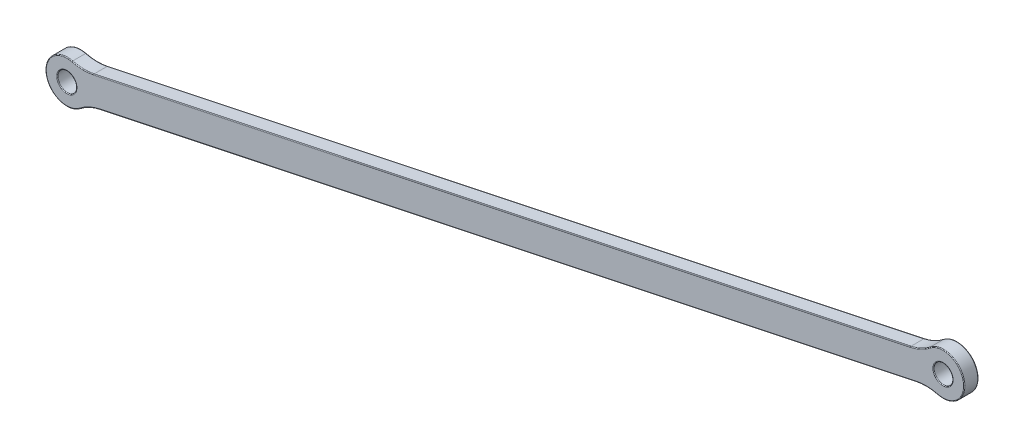
ISO-10303-21;
HEADER;
FILE_DESCRIPTION(('STEP AP214'),'2;1');
FILE_NAME('part.step','',(''),(''),'','','');
FILE_SCHEMA(('AUTOMOTIVE_DESIGN { 1 0 10303 214 1 1 1 1 }'));
ENDSEC;
DATA;
#1=APPLICATION_CONTEXT('core data for automotive mechanical design processes');
#2=APPLICATION_PROTOCOL_DEFINITION('international standard','automotive_design',2000,#1);
#3=PRODUCT_CONTEXT('',#1,'mechanical');
#4=PRODUCT('Part','Part','',(#3));
#5=PRODUCT_RELATED_PRODUCT_CATEGORY('part','',(#4));
#6=PRODUCT_DEFINITION_FORMATION('','',#4);
#7=PRODUCT_DEFINITION_CONTEXT('part definition',#1,'design');
#8=PRODUCT_DEFINITION('design','',#6,#7);
#9=PRODUCT_DEFINITION_SHAPE('','',#8);
#10=(LENGTH_UNIT() NAMED_UNIT(*) SI_UNIT(.MILLI.,.METRE.));
#11=(NAMED_UNIT(*) PLANE_ANGLE_UNIT() SI_UNIT($,.RADIAN.));
#12=(NAMED_UNIT(*) SI_UNIT($,.STERADIAN.) SOLID_ANGLE_UNIT());
#13=UNCERTAINTY_MEASURE_WITH_UNIT(LENGTH_MEASURE(1.E-05),#10,'distance_accuracy_value','');
#14=(GEOMETRIC_REPRESENTATION_CONTEXT(3) GLOBAL_UNCERTAINTY_ASSIGNED_CONTEXT((#13)) GLOBAL_UNIT_ASSIGNED_CONTEXT((#10,
#11,#12)) REPRESENTATION_CONTEXT('',''));
#15=CARTESIAN_POINT('',(0.,0.,0.));
#16=DIRECTION('',(0.,0.,1.));
#17=DIRECTION('',(1.,0.,0.));
#18=AXIS2_PLACEMENT_3D('',#15,#16,#17);
#19=CARTESIAN_POINT('',(-48.2386771546592,228.345201245127,-3.));
#20=DIRECTION('',(0.206691529175114,-0.978406158896832,0.));
#21=DIRECTION('',(0.978406158896832,0.206691529175114,0.));
#22=AXIS2_PLACEMENT_3D('',#19,#20,#21);
#23=PLANE('',#22);
#24=DIRECTION('',(0.,0.,-1.));
#25=VECTOR('',#24,1.);
#26=CARTESIAN_POINT('',(-203.551219813431,195.534914177421,-3.));
#27=LINE('',#26,#25);
#28=CARTESIAN_POINT('',(-203.551219813431,195.534914177421,-0.15));
#29=VERTEX_POINT('',#28);
#30=CARTESIAN_POINT('',(-203.551219813431,195.534914177421,-2.85));
#31=VERTEX_POINT('',#30);
#32=EDGE_CURVE('E302',#29,#31,#27,.T.);
#33=ORIENTED_EDGE('',*,*,#32,.T.);
#34=DIRECTION('',(0.978406158896832,0.206691529175114,0.));
#35=VECTOR('',#34,1.);
#36=CARTESIAN_POINT('',(-30.6132667540202,232.068627344728,-2.85));
#37=LINE('',#36,#35);
#38=CARTESIAN_POINT('',(-30.6132667540202,232.068627344728,-2.85));
#39=VERTEX_POINT('',#38);
#40=EDGE_CURVE('E209',#31,#39,#37,.T.);
#41=ORIENTED_EDGE('',*,*,#40,.T.);
#42=DIRECTION('',(0.,0.,-1.));
#43=VECTOR('',#42,1.);
#44=CARTESIAN_POINT('',(-30.6132667540202,232.068627344728,0.));
#45=LINE('',#44,#43);
#46=CARTESIAN_POINT('',(-30.6132667540202,232.068627344728,-0.15));
#47=VERTEX_POINT('',#46);
#48=EDGE_CURVE('E296',#39,#47,#45,.F.);
#49=ORIENTED_EDGE('',*,*,#48,.T.);
#50=DIRECTION('',(0.978406158896832,0.206691529175114,0.));
#51=VECTOR('',#50,1.);
#52=CARTESIAN_POINT('',(-48.2386771546592,228.345201245127,-0.15));
#53=LINE('',#52,#51);
#54=EDGE_CURVE('E207',#47,#29,#53,.F.);
#55=ORIENTED_EDGE('',*,*,#54,.T.);
#56=EDGE_LOOP('',(#33,#41,#49,#55));
#57=FACE_BOUND('',#56,.T.);
#58=ADVANCED_FACE('F34',(#57),#23,.T.);
#59=CARTESIAN_POINT('',(-210.455221734671,197.142632271964,-3.));
#60=DIRECTION('',(0.,0.,1.));
#61=DIRECTION('',(1.,0.,0.));
#62=AXIS2_PLACEMENT_3D('',#59,#60,#61);
#63=CYLINDRICAL_SURFACE('',#62,4.5);
#64=DIRECTION('',(0.,0.,1.));
#65=VECTOR('',#64,1.);
#66=CARTESIAN_POINT('',(-209.338930800535,201.50197792818,-3.));
#67=LINE('',#66,#65);
#68=CARTESIAN_POINT('',(-209.338930800535,201.50197792818,-0.15));
#69=VERTEX_POINT('',#68);
#70=CARTESIAN_POINT('',(-209.338930800535,201.50197792818,-2.85));
#71=VERTEX_POINT('',#70);
#72=EDGE_CURVE('E301',#69,#71,#67,.F.);
#73=ORIENTED_EDGE('',*,*,#72,.T.);
#74=CARTESIAN_POINT('',(-210.455221734671,197.142632271964,-2.85));
#75=DIRECTION('',(0.,0.,1.));
#76=DIRECTION('',(1.,0.,0.));
#77=AXIS2_PLACEMENT_3D('',#74,#75,#76);
#78=CIRCLE('',#77,4.5);
#79=CARTESIAN_POINT('',(-207.671143978915,193.607252370185,-2.85));
#80=VERTEX_POINT('',#79);
#81=EDGE_CURVE('E201',#71,#80,#78,.T.);
#82=ORIENTED_EDGE('',*,*,#81,.T.);
#83=DIRECTION('',(0.,0.,1.));
#84=VECTOR('',#83,1.);
#85=CARTESIAN_POINT('',(-207.671143978915,193.607252370185,-3.));
#86=LINE('',#85,#84);
#87=CARTESIAN_POINT('',(-207.671143978915,193.607252370185,-0.15));
#88=VERTEX_POINT('',#87);
#89=EDGE_CURVE('E305',#80,#88,#86,.T.);
#90=ORIENTED_EDGE('',*,*,#89,.T.);
#91=CARTESIAN_POINT('',(-210.455221734671,197.142632271964,-0.15));
#92=DIRECTION('',(0.,0.,1.));
#93=DIRECTION('',(1.,0.,0.));
#94=AXIS2_PLACEMENT_3D('',#91,#92,#93);
#95=CIRCLE('',#94,4.5);
#96=EDGE_CURVE('E199',#88,#69,#95,.F.);
#97=ORIENTED_EDGE('',*,*,#96,.T.);
#98=EDGE_LOOP('',(#73,#82,#90,#97));
#99=FACE_BOUND('',#98,.T.);
#100=ADVANCED_FACE('F367',(#99),#63,.T.);
#101=CARTESIAN_POINT('',(-49.4788263297099,234.215638198508,-3.));
#102=DIRECTION('',(0.206691529175114,-0.978406158896832,0.));
#103=DIRECTION('',(0.978406158896832,0.206691529175114,0.));
#104=AXIS2_PLACEMENT_3D('',#101,#102,#103);
#105=PLANE('',#104);
#106=DIRECTION('',(0.,0.,1.));
#107=VECTOR('',#106,1.);
#108=CARTESIAN_POINT('',(-31.8534159290709,237.939064298109,-3.));
#109=LINE('',#108,#107);
#110=CARTESIAN_POINT('',(-31.8534159290709,237.939064298109,-0.15));
#111=VERTEX_POINT('',#110);
#112=CARTESIAN_POINT('',(-31.8534159290709,237.939064298109,-2.85));
#113=VERTEX_POINT('',#112);
#114=EDGE_CURVE('E307',#111,#113,#109,.F.);
#115=ORIENTED_EDGE('',*,*,#114,.T.);
#116=DIRECTION('',(0.978406158896832,0.206691529175114,0.));
#117=VECTOR('',#116,1.);
#118=CARTESIAN_POINT('',(-49.4788263297099,234.215638198508,-2.85));
#119=LINE('',#118,#117);
#120=CARTESIAN_POINT('',(-204.791368988482,201.405351130802,-2.85));
#121=VERTEX_POINT('',#120);
#122=EDGE_CURVE('E192',#113,#121,#119,.F.);
#123=ORIENTED_EDGE('',*,*,#122,.T.);
#124=DIRECTION('',(0.,0.,1.));
#125=VECTOR('',#124,1.);
#126=CARTESIAN_POINT('',(-204.791368988482,201.405351130802,-3.));
#127=LINE('',#126,#125);
#128=CARTESIAN_POINT('',(-204.791368988482,201.405351130802,-0.15));
#129=VERTEX_POINT('',#128);
#130=EDGE_CURVE('E340',#121,#129,#127,.T.);
#131=ORIENTED_EDGE('',*,*,#130,.T.);
#132=DIRECTION('',(0.978406158896832,0.206691529175114,0.));
#133=VECTOR('',#132,1.);
#134=CARTESIAN_POINT('',(-31.8534159290709,237.939064298109,-0.15));
#135=LINE('',#134,#133);
#136=EDGE_CURVE('E190',#129,#111,#135,.T.);
#137=ORIENTED_EDGE('',*,*,#136,.T.);
#138=EDGE_LOOP('',(#115,#123,#131,#137));
#139=FACE_BOUND('',#138,.T.);
#140=ADVANCED_FACE('F348',(#139),#105,.F.);
#141=CARTESIAN_POINT('',(-210.455221734671,197.142632271964,-3.));
#142=DIRECTION('',(0.,0.,1.));
#143=DIRECTION('',(1.,0.,0.));
#144=AXIS2_PLACEMENT_3D('',#141,#142,#143);
#145=CYLINDRICAL_SURFACE('',#144,2.);
#146=CARTESIAN_POINT('',(-210.455221734671,197.142632271964,-2.85));
#147=DIRECTION('',(0.,0.,1.));
#148=DIRECTION('',(1.,0.,0.));
#149=AXIS2_PLACEMENT_3D('',#146,#147,#148);
#150=CIRCLE('',#149,2.);
#151=CARTESIAN_POINT('',(-208.455221734671,197.142632271964,-2.85));
#152=VERTEX_POINT('',#151);
#153=EDGE_CURVE('E214',#152,#152,#150,.F.);
#154=ORIENTED_EDGE('',*,*,#153,.T.);
#155=EDGE_LOOP('',(#154));
#156=FACE_BOUND('',#155,.T.);
#157=CARTESIAN_POINT('',(-210.455221734671,197.142632271964,-0.15));
#158=DIRECTION('',(0.,0.,1.));
#159=DIRECTION('',(1.,0.,0.));
#160=AXIS2_PLACEMENT_3D('',#157,#158,#159);
#161=CIRCLE('',#160,2.);
#162=CARTESIAN_POINT('',(-208.455221734671,197.142632271964,-0.15));
#163=VERTEX_POINT('',#162);
#164=EDGE_CURVE('E211',#163,#163,#161,.T.);
#165=ORIENTED_EDGE('',*,*,#164,.T.);
#166=EDGE_LOOP('',(#165));
#167=FACE_BOUND('',#166,.T.);
#168=ADVANCED_FACE('F403',(#156,#167),#145,.F.);
#169=CARTESIAN_POINT('',(-24.9494140078315,236.331346203566,-3.));
#170=DIRECTION('',(0.,0.,1.));
#171=DIRECTION('',(1.,0.,0.));
#172=AXIS2_PLACEMENT_3D('',#169,#170,#171);
#173=CYLINDRICAL_SURFACE('',#172,2.);
#174=CARTESIAN_POINT('',(-24.9494140078315,236.331346203566,-2.85));
#175=DIRECTION('',(0.,0.,1.));
#176=DIRECTION('',(1.,0.,0.));
#177=AXIS2_PLACEMENT_3D('',#174,#175,#176);
#178=CIRCLE('',#177,2.);
#179=CARTESIAN_POINT('',(-22.9494140078315,236.331346203566,-2.85));
#180=VERTEX_POINT('',#179);
#181=EDGE_CURVE('E220',#180,#180,#178,.F.);
#182=ORIENTED_EDGE('',*,*,#181,.T.);
#183=EDGE_LOOP('',(#182));
#184=FACE_BOUND('',#183,.T.);
#185=CARTESIAN_POINT('',(-24.9494140078315,236.331346203566,-0.15));
#186=DIRECTION('',(0.,0.,1.));
#187=DIRECTION('',(1.,0.,0.));
#188=AXIS2_PLACEMENT_3D('',#185,#186,#187);
#189=CIRCLE('',#188,2.);
#190=CARTESIAN_POINT('',(-22.9494140078315,236.331346203566,-0.15));
#191=VERTEX_POINT('',#190);
#192=EDGE_CURVE('E217',#191,#191,#189,.T.);
#193=ORIENTED_EDGE('',*,*,#192,.T.);
#194=EDGE_LOOP('',(#193));
#195=FACE_BOUND('',#194,.T.);
#196=ADVANCED_FACE('F405',(#184,#195),#173,.F.);
#197=CARTESIAN_POINT('',(-24.9494140078315,236.331346203566,-3.));
#198=DIRECTION('',(0.,0.,1.));
#199=DIRECTION('',(1.,0.,0.));
#200=AXIS2_PLACEMENT_3D('',#197,#198,#199);
#201=CYLINDRICAL_SURFACE('',#200,4.5);
#202=DIRECTION('',(0.,0.,1.));
#203=VECTOR('',#202,1.);
#204=CARTESIAN_POINT('',(-26.0657049419673,231.97200054735,-3.));
#205=LINE('',#204,#203);
#206=CARTESIAN_POINT('',(-26.0657049419673,231.97200054735,-0.15));
#207=VERTEX_POINT('',#206);
#208=CARTESIAN_POINT('',(-26.0657049419673,231.97200054735,-2.85));
#209=VERTEX_POINT('',#208);
#210=EDGE_CURVE('E258',#207,#209,#205,.F.);
#211=ORIENTED_EDGE('',*,*,#210,.T.);
#212=CARTESIAN_POINT('',(-24.9494140078315,236.331346203566,-2.85));
#213=DIRECTION('',(0.,0.,1.));
#214=DIRECTION('',(1.,0.,0.));
#215=AXIS2_PLACEMENT_3D('',#212,#213,#214);
#216=CIRCLE('',#215,4.5);
#217=CARTESIAN_POINT('',(-27.7334917635872,239.866726105345,-2.85));
#218=VERTEX_POINT('',#217);
#219=EDGE_CURVE('E184',#209,#218,#216,.T.);
#220=ORIENTED_EDGE('',*,*,#219,.T.);
#221=DIRECTION('',(0.,0.,1.));
#222=VECTOR('',#221,1.);
#223=CARTESIAN_POINT('',(-27.7334917635872,239.866726105345,-3.));
#224=LINE('',#223,#222);
#225=CARTESIAN_POINT('',(-27.7334917635872,239.866726105345,-0.15));
#226=VERTEX_POINT('',#225);
#227=EDGE_CURVE('E338',#218,#226,#224,.T.);
#228=ORIENTED_EDGE('',*,*,#227,.T.);
#229=CARTESIAN_POINT('',(-24.9494140078315,236.331346203566,-0.15));
#230=DIRECTION('',(0.,0.,1.));
#231=DIRECTION('',(1.,0.,0.));
#232=AXIS2_PLACEMENT_3D('',#229,#230,#231);
#233=CIRCLE('',#232,4.5);
#234=EDGE_CURVE('E182',#226,#207,#233,.F.);
#235=ORIENTED_EDGE('',*,*,#234,.T.);
#236=EDGE_LOOP('',(#211,#220,#228,#235));
#237=FACE_BOUND('',#236,.T.);
#238=ADVANCED_FACE('F337',(#237),#201,.T.);
#239=CARTESIAN_POINT('',(0.,0.,-3.));
#240=DIRECTION('',(0.,0.,1.));
#241=DIRECTION('',(1.,0.,0.));
#242=AXIS2_PLACEMENT_3D('',#239,#240,#241);
#243=PLANE('',#242);
#244=CARTESIAN_POINT('',(-24.9494140078315,236.331346203566,-3.));
#245=DIRECTION('',(0.,0.,1.));
#246=DIRECTION('',(1.,0.,0.));
#247=AXIS2_PLACEMENT_3D('',#244,#245,#246);
#248=CIRCLE('',#247,4.35);
#249=CARTESIAN_POINT('',(-27.6406891717287,239.748880108619,-3.));
#250=VERTEX_POINT('',#249);
#251=CARTESIAN_POINT('',(-26.0284952441628,232.117312069224,-3.));
#252=VERTEX_POINT('',#251);
#253=EDGE_CURVE('E172',#250,#252,#248,.F.);
#254=ORIENTED_EDGE('',*,*,#253,.T.);
#255=CARTESIAN_POINT('',(-28.5463514622691,222.28456575576,-3.));
#256=DIRECTION('',(0.,0.,1.));
#257=DIRECTION('',(1.,0.,0.));
#258=AXIS2_PLACEMENT_3D('',#255,#256,#257);
#259=CIRCLE('',#258,10.15);
#260=CARTESIAN_POINT('',(-30.6442704833965,232.215388268563,-3.));
#261=VERTEX_POINT('',#260);
#262=EDGE_CURVE('E152',#252,#261,#259,.T.);
#263=ORIENTED_EDGE('',*,*,#262,.T.);
#264=DIRECTION('',(0.978406158896832,0.206691529175114,0.));
#265=VECTOR('',#264,1.);
#266=CARTESIAN_POINT('',(-203.582223542808,195.681675101255,-3.));
#267=LINE('',#266,#265);
#268=CARTESIAN_POINT('',(-203.582223542808,195.681675101255,-3.));
#269=VERTEX_POINT('',#268);
#270=EDGE_CURVE('E160',#261,#269,#267,.F.);
#271=ORIENTED_EDGE('',*,*,#270,.T.);
#272=CARTESIAN_POINT('',(-201.48430452168,185.750852588453,-3.));
#273=DIRECTION('',(0.,0.,1.));
#274=DIRECTION('',(1.,0.,0.));
#275=AXIS2_PLACEMENT_3D('',#272,#273,#274);
#276=CIRCLE('',#275,10.15);
#277=CARTESIAN_POINT('',(-207.763946570774,193.725098366911,-3.));
#278=VERTEX_POINT('',#277);
#279=EDGE_CURVE('E166',#269,#278,#276,.T.);
#280=ORIENTED_EDGE('',*,*,#279,.T.);
#281=CARTESIAN_POINT('',(-210.455221734671,197.142632271964,-3.));
#282=DIRECTION('',(0.,0.,1.));
#283=DIRECTION('',(1.,0.,0.));
#284=AXIS2_PLACEMENT_3D('',#281,#282,#283);
#285=CIRCLE('',#284,4.35);
#286=CARTESIAN_POINT('',(-209.37614049834,201.356666406306,-3.));
#287=VERTEX_POINT('',#286);
#288=EDGE_CURVE('E319',#278,#287,#285,.F.);
#289=ORIENTED_EDGE('',*,*,#288,.T.);
#290=CARTESIAN_POINT('',(-206.858284280233,211.18941271977,-3.));
#291=DIRECTION('',(0.,0.,1.));
#292=DIRECTION('',(1.,0.,0.));
#293=AXIS2_PLACEMENT_3D('',#290,#291,#292);
#294=CIRCLE('',#293,10.15);
#295=CARTESIAN_POINT('',(-204.760365259106,201.258590206967,-3.));
#296=VERTEX_POINT('',#295);
#297=EDGE_CURVE('E321',#287,#296,#294,.T.);
#298=ORIENTED_EDGE('',*,*,#297,.T.);
#299=DIRECTION('',(0.978406158896832,0.206691529175114,0.));
#300=VECTOR('',#299,1.);
#301=CARTESIAN_POINT('',(-49.4478226003336,234.068877274674,-3.));
#302=LINE('',#301,#300);
#303=CARTESIAN_POINT('',(-31.8224121996946,237.792303374275,-3.));
#304=VERTEX_POINT('',#303);
#305=EDGE_CURVE('E323',#296,#304,#302,.T.);
#306=ORIENTED_EDGE('',*,*,#305,.T.);
#307=CARTESIAN_POINT('',(-33.920331220822,247.723125887078,-3.));
#308=DIRECTION('',(0.,0.,1.));
#309=DIRECTION('',(1.,0.,0.));
#310=AXIS2_PLACEMENT_3D('',#307,#308,#309);
#311=CIRCLE('',#310,10.15);
#312=EDGE_CURVE('E177',#304,#250,#311,.T.);
#313=ORIENTED_EDGE('',*,*,#312,.T.);
#314=EDGE_LOOP('',(#254,#263,#271,#280,#289,#298,#306,#313));
#315=FACE_BOUND('',#314,.T.);
#316=CARTESIAN_POINT('',(-210.455221734671,197.142632271964,-3.));
#317=DIRECTION('',(0.,0.,1.));
#318=DIRECTION('',(1.,0.,0.));
#319=AXIS2_PLACEMENT_3D('',#316,#317,#318);
#320=CIRCLE('',#319,2.15);
#321=CARTESIAN_POINT('',(-208.305221734671,197.142632271964,-3.));
#322=VERTEX_POINT('',#321);
#323=EDGE_CURVE('E167',#322,#322,#320,.T.);
#324=ORIENTED_EDGE('',*,*,#323,.T.);
#325=EDGE_LOOP('',(#324));
#326=FACE_BOUND('',#325,.T.);
#327=CARTESIAN_POINT('',(-24.9494140078315,236.331346203566,-3.));
#328=DIRECTION('',(0.,0.,1.));
#329=DIRECTION('',(1.,0.,0.));
#330=AXIS2_PLACEMENT_3D('',#327,#328,#329);
#331=CIRCLE('',#330,2.15);
#332=CARTESIAN_POINT('',(-22.7994140078315,236.331346203566,-3.));
#333=VERTEX_POINT('',#332);
#334=EDGE_CURVE('E313',#333,#333,#331,.T.);
#335=ORIENTED_EDGE('',*,*,#334,.T.);
#336=EDGE_LOOP('',(#335));
#337=FACE_BOUND('',#336,.T.);
#338=ADVANCED_FACE('F169',(#315,#326,#337),#243,.F.);
#339=CARTESIAN_POINT('',(0.,0.,0.));
#340=DIRECTION('',(0.,0.,1.));
#341=DIRECTION('',(1.,0.,0.));
#342=AXIS2_PLACEMENT_3D('',#339,#340,#341);
#343=PLANE('',#342);
#344=DIRECTION('',(0.978406158896832,0.206691529175114,0.));
#345=VECTOR('',#344,1.);
#346=CARTESIAN_POINT('',(-204.760365259106,201.258590206967,0.));
#347=LINE('',#346,#345);
#348=CARTESIAN_POINT('',(-31.8224121996946,237.792303374275,0.));
#349=VERTEX_POINT('',#348);
#350=CARTESIAN_POINT('',(-204.760365259106,201.258590206967,0.));
#351=VERTEX_POINT('',#350);
#352=EDGE_CURVE('E43',#349,#351,#347,.F.);
#353=ORIENTED_EDGE('',*,*,#352,.T.);
#354=CARTESIAN_POINT('',(-206.858284280233,211.18941271977,0.));
#355=DIRECTION('',(0.,0.,1.));
#356=DIRECTION('',(1.,0.,0.));
#357=AXIS2_PLACEMENT_3D('',#354,#355,#356);
#358=CIRCLE('',#357,10.15);
#359=CARTESIAN_POINT('',(-209.37614049834,201.356666406306,0.));
#360=VERTEX_POINT('',#359);
#361=EDGE_CURVE('E11',#351,#360,#358,.F.);
#362=ORIENTED_EDGE('',*,*,#361,.T.);
#363=CARTESIAN_POINT('',(-210.455221734671,197.142632271964,0.));
#364=DIRECTION('',(0.,0.,1.));
#365=DIRECTION('',(1.,0.,0.));
#366=AXIS2_PLACEMENT_3D('',#363,#364,#365);
#367=CIRCLE('',#366,4.35);
#368=CARTESIAN_POINT('',(-207.763946570774,193.725098366911,0.));
#369=VERTEX_POINT('',#368);
#370=EDGE_CURVE('E229',#360,#369,#367,.T.);
#371=ORIENTED_EDGE('',*,*,#370,.T.);
#372=CARTESIAN_POINT('',(-201.48430452168,185.750852588453,0.));
#373=DIRECTION('',(0.,0.,1.));
#374=DIRECTION('',(1.,0.,0.));
#375=AXIS2_PLACEMENT_3D('',#372,#373,#374);
#376=CIRCLE('',#375,10.15);
#377=CARTESIAN_POINT('',(-203.582223542808,195.681675101255,0.));
#378=VERTEX_POINT('',#377);
#379=EDGE_CURVE('E231',#369,#378,#376,.F.);
#380=ORIENTED_EDGE('',*,*,#379,.T.);
#381=DIRECTION('',(0.978406158896832,0.206691529175114,0.));
#382=VECTOR('',#381,1.);
#383=CARTESIAN_POINT('',(-48.2696808840355,228.491962168962,0.));
#384=LINE('',#383,#382);
#385=CARTESIAN_POINT('',(-30.6442704833965,232.215388268563,0.));
#386=VERTEX_POINT('',#385);
#387=EDGE_CURVE('E233',#378,#386,#384,.T.);
#388=ORIENTED_EDGE('',*,*,#387,.T.);
#389=CARTESIAN_POINT('',(-28.5463514622691,222.28456575576,0.));
#390=DIRECTION('',(0.,0.,1.));
#391=DIRECTION('',(1.,0.,0.));
#392=AXIS2_PLACEMENT_3D('',#389,#390,#391);
#393=CIRCLE('',#392,10.15);
#394=CARTESIAN_POINT('',(-26.0284952441628,232.117312069224,0.));
#395=VERTEX_POINT('',#394);
#396=EDGE_CURVE('E235',#386,#395,#393,.F.);
#397=ORIENTED_EDGE('',*,*,#396,.T.);
#398=CARTESIAN_POINT('',(-24.9494140078315,236.331346203566,0.));
#399=DIRECTION('',(0.,0.,1.));
#400=DIRECTION('',(1.,0.,0.));
#401=AXIS2_PLACEMENT_3D('',#398,#399,#400);
#402=CIRCLE('',#401,4.35);
#403=CARTESIAN_POINT('',(-27.6406891717287,239.748880108619,0.));
#404=VERTEX_POINT('',#403);
#405=EDGE_CURVE('E237',#395,#404,#402,.T.);
#406=ORIENTED_EDGE('',*,*,#405,.T.);
#407=CARTESIAN_POINT('',(-33.920331220822,247.723125887078,0.));
#408=DIRECTION('',(0.,0.,1.));
#409=DIRECTION('',(1.,0.,0.));
#410=AXIS2_PLACEMENT_3D('',#407,#408,#409);
#411=CIRCLE('',#410,10.15);
#412=EDGE_CURVE('E54',#404,#349,#411,.F.);
#413=ORIENTED_EDGE('',*,*,#412,.T.);
#414=EDGE_LOOP('',(#353,#362,#371,#380,#388,#397,#406,#413));
#415=FACE_BOUND('',#414,.T.);
#416=CARTESIAN_POINT('',(-210.455221734671,197.142632271964,0.));
#417=DIRECTION('',(0.,0.,1.));
#418=DIRECTION('',(1.,0.,0.));
#419=AXIS2_PLACEMENT_3D('',#416,#417,#418);
#420=CIRCLE('',#419,2.15);
#421=CARTESIAN_POINT('',(-208.305221734671,197.142632271964,0.));
#422=VERTEX_POINT('',#421);
#423=EDGE_CURVE('E226',#422,#422,#420,.F.);
#424=ORIENTED_EDGE('',*,*,#423,.T.);
#425=EDGE_LOOP('',(#424));
#426=FACE_BOUND('',#425,.T.);
#427=CARTESIAN_POINT('',(-24.9494140078315,236.331346203566,0.));
#428=DIRECTION('',(0.,0.,1.));
#429=DIRECTION('',(1.,0.,0.));
#430=AXIS2_PLACEMENT_3D('',#427,#428,#429);
#431=CIRCLE('',#430,2.15);
#432=CARTESIAN_POINT('',(-22.7994140078315,236.331346203566,0.));
#433=VERTEX_POINT('',#432);
#434=EDGE_CURVE('E223',#433,#433,#431,.F.);
#435=ORIENTED_EDGE('',*,*,#434,.T.);
#436=EDGE_LOOP('',(#435));
#437=FACE_BOUND('',#436,.T.);
#438=ADVANCED_FACE('F384',(#415,#426,#437),#343,.T.);
#439=CARTESIAN_POINT('',(-33.920331220822,247.723125887078,-3.));
#440=DIRECTION('',(0.,0.,1.));
#441=DIRECTION('',(1.,0.,0.));
#442=AXIS2_PLACEMENT_3D('',#439,#440,#441);
#443=CYLINDRICAL_SURFACE('',#442,10.);
#444=ORIENTED_EDGE('',*,*,#227,.F.);
#445=CARTESIAN_POINT('',(-33.920331220822,247.723125887078,-2.85));
#446=DIRECTION('',(0.,0.,1.));
#447=DIRECTION('',(1.,0.,0.));
#448=AXIS2_PLACEMENT_3D('',#445,#446,#447);
#449=CIRCLE('',#448,10.);
#450=EDGE_CURVE('E188',#218,#113,#449,.F.);
#451=ORIENTED_EDGE('',*,*,#450,.T.);
#452=ORIENTED_EDGE('',*,*,#114,.F.);
#453=CARTESIAN_POINT('',(-33.920331220822,247.723125887078,-0.15));
#454=DIRECTION('',(0.,0.,1.));
#455=DIRECTION('',(1.,0.,0.));
#456=AXIS2_PLACEMENT_3D('',#453,#454,#455);
#457=CIRCLE('',#456,10.);
#458=EDGE_CURVE('E186',#111,#226,#457,.T.);
#459=ORIENTED_EDGE('',*,*,#458,.T.);
#460=EDGE_LOOP('',(#444,#451,#452,#459));
#461=FACE_BOUND('',#460,.T.);
#462=ADVANCED_FACE('F382',(#461),#443,.F.);
#463=CARTESIAN_POINT('',(-28.5463514622691,222.28456575576,-3.));
#464=DIRECTION('',(0.,0.,1.));
#465=DIRECTION('',(1.,0.,0.));
#466=AXIS2_PLACEMENT_3D('',#463,#464,#465);
#467=CYLINDRICAL_SURFACE('',#466,10.);
#468=ORIENTED_EDGE('',*,*,#48,.F.);
#469=CARTESIAN_POINT('',(-28.5463514622691,222.28456575576,-2.85));
#470=DIRECTION('',(0.,0.,1.));
#471=DIRECTION('',(1.,0.,0.));
#472=AXIS2_PLACEMENT_3D('',#469,#470,#471);
#473=CIRCLE('',#472,10.);
#474=EDGE_CURVE('E154',#39,#209,#473,.F.);
#475=ORIENTED_EDGE('',*,*,#474,.T.);
#476=ORIENTED_EDGE('',*,*,#210,.F.);
#477=CARTESIAN_POINT('',(-28.5463514622691,222.28456575576,-0.15));
#478=DIRECTION('',(0.,0.,1.));
#479=DIRECTION('',(1.,0.,0.));
#480=AXIS2_PLACEMENT_3D('',#477,#478,#479);
#481=CIRCLE('',#480,10.);
#482=EDGE_CURVE('E174',#207,#47,#481,.T.);
#483=ORIENTED_EDGE('',*,*,#482,.T.);
#484=EDGE_LOOP('',(#468,#475,#476,#483));
#485=FACE_BOUND('',#484,.T.);
#486=ADVANCED_FACE('F295',(#485),#467,.F.);
#487=CARTESIAN_POINT('',(-201.48430452168,185.750852588453,-3.));
#488=DIRECTION('',(0.,0.,1.));
#489=DIRECTION('',(1.,0.,0.));
#490=AXIS2_PLACEMENT_3D('',#487,#488,#489);
#491=CYLINDRICAL_SURFACE('',#490,10.);
#492=ORIENTED_EDGE('',*,*,#89,.F.);
#493=CARTESIAN_POINT('',(-201.48430452168,185.750852588453,-2.85));
#494=DIRECTION('',(0.,0.,1.));
#495=DIRECTION('',(1.,0.,0.));
#496=AXIS2_PLACEMENT_3D('',#493,#494,#495);
#497=CIRCLE('',#496,10.);
#498=EDGE_CURVE('E205',#80,#31,#497,.F.);
#499=ORIENTED_EDGE('',*,*,#498,.T.);
#500=ORIENTED_EDGE('',*,*,#32,.F.);
#501=CARTESIAN_POINT('',(-201.48430452168,185.750852588453,-0.15));
#502=DIRECTION('',(0.,0.,1.));
#503=DIRECTION('',(1.,0.,0.));
#504=AXIS2_PLACEMENT_3D('',#501,#502,#503);
#505=CIRCLE('',#504,10.);
#506=EDGE_CURVE('E203',#29,#88,#505,.T.);
#507=ORIENTED_EDGE('',*,*,#506,.T.);
#508=EDGE_LOOP('',(#492,#499,#500,#507));
#509=FACE_BOUND('',#508,.T.);
#510=ADVANCED_FACE('F390',(#509),#491,.F.);
#511=CARTESIAN_POINT('',(-206.858284280233,211.18941271977,-3.));
#512=DIRECTION('',(0.,0.,1.));
#513=DIRECTION('',(1.,0.,0.));
#514=AXIS2_PLACEMENT_3D('',#511,#512,#513);
#515=CYLINDRICAL_SURFACE('',#514,10.);
#516=ORIENTED_EDGE('',*,*,#130,.F.);
#517=CARTESIAN_POINT('',(-206.858284280233,211.18941271977,-2.85));
#518=DIRECTION('',(0.,0.,1.));
#519=DIRECTION('',(1.,0.,0.));
#520=AXIS2_PLACEMENT_3D('',#517,#518,#519);
#521=CIRCLE('',#520,10.);
#522=EDGE_CURVE('E197',#121,#71,#521,.F.);
#523=ORIENTED_EDGE('',*,*,#522,.T.);
#524=ORIENTED_EDGE('',*,*,#72,.F.);
#525=CARTESIAN_POINT('',(-206.858284280233,211.18941271977,-0.15));
#526=DIRECTION('',(0.,0.,1.));
#527=DIRECTION('',(1.,0.,0.));
#528=AXIS2_PLACEMENT_3D('',#525,#526,#527);
#529=CIRCLE('',#528,10.);
#530=EDGE_CURVE('E194',#69,#129,#529,.T.);
#531=ORIENTED_EDGE('',*,*,#530,.T.);
#532=EDGE_LOOP('',(#516,#523,#524,#531));
#533=FACE_BOUND('',#532,.T.);
#534=ADVANCED_FACE('F364',(#533),#515,.F.);
#535=CARTESIAN_POINT('',(-206.858284280233,211.18941271977,-2.85));
#536=DIRECTION('',(0.,0.,1.));
#537=DIRECTION('',(1.,0.,0.));
#538=AXIS2_PLACEMENT_3D('',#535,#536,#537);
#539=TOROIDAL_SURFACE('',#538,10.15,0.15);
#540=CARTESIAN_POINT('',(-209.37614049834,201.356666406306,-2.85));
#541=DIRECTION('',(-0.968743479159046,0.248064652030123,0.));
#542=DIRECTION('',(-0.248064652030123,-0.968743479159047,0.));
#543=AXIS2_PLACEMENT_3D('',#540,#541,#542);
#544=CIRCLE('',#543,0.15);
#545=EDGE_CURVE('E252',#71,#287,#544,.T.);
#546=ORIENTED_EDGE('',*,*,#545,.F.);
#547=ORIENTED_EDGE('',*,*,#522,.F.);
#548=CARTESIAN_POINT('',(-204.760365259106,201.258590206967,-2.85));
#549=DIRECTION('',(0.97840615889685,0.20669152917503,0.));
#550=DIRECTION('',(-0.20669152917503,0.97840615889685,0.));
#551=AXIS2_PLACEMENT_3D('',#548,#549,#550);
#552=CIRCLE('',#551,0.15);
#553=EDGE_CURVE('E255',#296,#121,#552,.T.);
#554=ORIENTED_EDGE('',*,*,#553,.F.);
#555=ORIENTED_EDGE('',*,*,#297,.F.);
#556=EDGE_LOOP('',(#546,#547,#554,#555));
#557=FACE_BOUND('',#556,.T.);
#558=ADVANCED_FACE('F360',(#557),#539,.T.);
#559=CARTESIAN_POINT('',(-49.4478226003336,234.068877274674,-2.85));
#560=DIRECTION('',(0.978406158896832,0.206691529175114,0.));
#561=DIRECTION('',(-0.206691529175114,0.978406158896832,0.));
#562=AXIS2_PLACEMENT_3D('',#559,#560,#561);
#563=CYLINDRICAL_SURFACE('',#562,0.15);
#564=ORIENTED_EDGE('',*,*,#553,.T.);
#565=ORIENTED_EDGE('',*,*,#122,.F.);
#566=CARTESIAN_POINT('',(-31.8224121996946,237.792303374275,-2.85));
#567=DIRECTION('',(0.978406158896822,0.206691529175163,0.));
#568=DIRECTION('',(-0.206691529175163,0.978406158896822,0.));
#569=AXIS2_PLACEMENT_3D('',#566,#567,#568);
#570=CIRCLE('',#569,0.15);
#571=EDGE_CURVE('E249',#304,#113,#570,.T.);
#572=ORIENTED_EDGE('',*,*,#571,.F.);
#573=ORIENTED_EDGE('',*,*,#305,.F.);
#574=EDGE_LOOP('',(#564,#565,#572,#573));
#575=FACE_BOUND('',#574,.T.);
#576=ADVANCED_FACE('F354',(#575),#563,.T.);
#577=CARTESIAN_POINT('',(-210.455221734671,197.142632271964,-2.85));
#578=DIRECTION('',(0.,0.,1.));
#579=DIRECTION('',(1.,0.,0.));
#580=AXIS2_PLACEMENT_3D('',#577,#578,#579);
#581=TOROIDAL_SURFACE('',#580,4.35,0.15);
#582=ORIENTED_EDGE('',*,*,#545,.T.);
#583=ORIENTED_EDGE('',*,*,#288,.F.);
#584=CARTESIAN_POINT('',(-207.763946570774,193.725098366911,-2.85));
#585=DIRECTION('',(0.785639978173268,0.618683945723426,0.));
#586=DIRECTION('',(-0.618683945723426,0.785639978173268,0.));
#587=AXIS2_PLACEMENT_3D('',#584,#585,#586);
#588=CIRCLE('',#587,0.15);
#589=EDGE_CURVE('E246',#80,#278,#588,.T.);
#590=ORIENTED_EDGE('',*,*,#589,.F.);
#591=ORIENTED_EDGE('',*,*,#81,.F.);
#592=EDGE_LOOP('',(#582,#583,#590,#591));
#593=FACE_BOUND('',#592,.T.);
#594=ADVANCED_FACE('F461',(#593),#581,.T.);
#595=CARTESIAN_POINT('',(-33.920331220822,247.723125887078,-2.85));
#596=DIRECTION('',(0.,0.,1.));
#597=DIRECTION('',(1.,0.,0.));
#598=AXIS2_PLACEMENT_3D('',#595,#596,#597);
#599=TOROIDAL_SURFACE('',#598,10.15,0.15);
#600=ORIENTED_EDGE('',*,*,#571,.T.);
#601=ORIENTED_EDGE('',*,*,#450,.F.);
#602=CARTESIAN_POINT('',(-27.6406891717287,239.748880108619,-2.85));
#603=DIRECTION('',(0.785639978173223,0.618683945723483,0.));
#604=DIRECTION('',(-0.618683945723483,0.785639978173223,0.));
#605=AXIS2_PLACEMENT_3D('',#602,#603,#604);
#606=CIRCLE('',#605,0.15);
#607=EDGE_CURVE('E243',#250,#218,#606,.T.);
#608=ORIENTED_EDGE('',*,*,#607,.F.);
#609=ORIENTED_EDGE('',*,*,#312,.F.);
#610=EDGE_LOOP('',(#600,#601,#608,#609));
#611=FACE_BOUND('',#610,.T.);
#612=ADVANCED_FACE('F330',(#611),#599,.T.);
#613=CARTESIAN_POINT('',(-201.48430452168,185.750852588453,-2.85));
#614=DIRECTION('',(0.,0.,1.));
#615=DIRECTION('',(1.,0.,0.));
#616=AXIS2_PLACEMENT_3D('',#613,#614,#615);
#617=TOROIDAL_SURFACE('',#616,10.15,0.15);
#618=ORIENTED_EDGE('',*,*,#589,.T.);
#619=ORIENTED_EDGE('',*,*,#279,.F.);
#620=CARTESIAN_POINT('',(-203.582223542808,195.681675101255,-2.85));
#621=DIRECTION('',(0.97840615889685,0.20669152917503,0.));
#622=DIRECTION('',(-0.20669152917503,0.97840615889685,0.));
#623=AXIS2_PLACEMENT_3D('',#620,#621,#622);
#624=CIRCLE('',#623,0.15);
#625=EDGE_CURVE('E163',#31,#269,#624,.T.);
#626=ORIENTED_EDGE('',*,*,#625,.F.);
#627=ORIENTED_EDGE('',*,*,#498,.F.);
#628=EDGE_LOOP('',(#618,#619,#626,#627));
#629=FACE_BOUND('',#628,.T.);
#630=ADVANCED_FACE('F467',(#629),#617,.T.);
#631=CARTESIAN_POINT('',(-24.9494140078315,236.331346203566,-2.85));
#632=DIRECTION('',(0.,0.,1.));
#633=DIRECTION('',(1.,0.,0.));
#634=AXIS2_PLACEMENT_3D('',#631,#632,#633);
#635=TOROIDAL_SURFACE('',#634,4.35,0.15);
#636=ORIENTED_EDGE('',*,*,#607,.T.);
#637=ORIENTED_EDGE('',*,*,#219,.F.);
#638=CARTESIAN_POINT('',(-26.0284952441628,232.117312069224,-2.85));
#639=DIRECTION('',(-0.968743479159041,0.248064652030145,0.));
#640=DIRECTION('',(-0.248064652030145,-0.968743479159041,0.));
#641=AXIS2_PLACEMENT_3D('',#638,#639,#640);
#642=CIRCLE('',#641,0.15);
#643=EDGE_CURVE('E157',#252,#209,#642,.T.);
#644=ORIENTED_EDGE('',*,*,#643,.F.);
#645=ORIENTED_EDGE('',*,*,#253,.F.);
#646=EDGE_LOOP('',(#636,#637,#644,#645));
#647=FACE_BOUND('',#646,.T.);
#648=ADVANCED_FACE('F333',(#647),#635,.T.);
#649=CARTESIAN_POINT('',(-48.2696808840355,228.491962168962,-2.85));
#650=DIRECTION('',(-0.978406158896832,-0.206691529175114,0.));
#651=DIRECTION('',(0.206691529175114,-0.978406158896832,0.));
#652=AXIS2_PLACEMENT_3D('',#649,#650,#651);
#653=CYLINDRICAL_SURFACE('',#652,0.15);
#654=ORIENTED_EDGE('',*,*,#625,.T.);
#655=ORIENTED_EDGE('',*,*,#270,.F.);
#656=CARTESIAN_POINT('',(-30.6442704833965,232.215388268563,-2.85));
#657=DIRECTION('',(0.978406158896836,0.206691529175096,0.));
#658=DIRECTION('',(-0.206691529175096,0.978406158896836,0.));
#659=AXIS2_PLACEMENT_3D('',#656,#657,#658);
#660=CIRCLE('',#659,0.15);
#661=EDGE_CURVE('E148',#39,#261,#660,.T.);
#662=ORIENTED_EDGE('',*,*,#661,.F.);
#663=ORIENTED_EDGE('',*,*,#40,.F.);
#664=EDGE_LOOP('',(#654,#655,#662,#663));
#665=FACE_BOUND('',#664,.T.);
#666=ADVANCED_FACE('F161',(#665),#653,.T.);
#667=CARTESIAN_POINT('',(-28.5463514622691,222.28456575576,-2.85));
#668=DIRECTION('',(0.,0.,1.));
#669=DIRECTION('',(1.,0.,0.));
#670=AXIS2_PLACEMENT_3D('',#667,#668,#669);
#671=TOROIDAL_SURFACE('',#670,10.15,0.15);
#672=ORIENTED_EDGE('',*,*,#643,.T.);
#673=ORIENTED_EDGE('',*,*,#474,.F.);
#674=ORIENTED_EDGE('',*,*,#661,.T.);
#675=ORIENTED_EDGE('',*,*,#262,.F.);
#676=EDGE_LOOP('',(#672,#673,#674,#675));
#677=FACE_BOUND('',#676,.T.);
#678=ADVANCED_FACE('F150',(#677),#671,.T.);
#679=CARTESIAN_POINT('',(-210.455221734671,197.142632271964,-2.85));
#680=DIRECTION('',(0.,0.,1.));
#681=DIRECTION('',(1.,0.,0.));
#682=AXIS2_PLACEMENT_3D('',#679,#680,#681);
#683=TOROIDAL_SURFACE('',#682,2.15,0.15);
#684=ORIENTED_EDGE('',*,*,#153,.F.);
#685=EDGE_LOOP('',(#684));
#686=FACE_BOUND('',#685,.T.);
#687=ORIENTED_EDGE('',*,*,#323,.F.);
#688=EDGE_LOOP('',(#687));
#689=FACE_BOUND('',#688,.T.);
#690=ADVANCED_FACE('F452',(#686,#689),#683,.T.);
#691=CARTESIAN_POINT('',(-24.9494140078315,236.331346203566,-2.85));
#692=DIRECTION('',(0.,0.,1.));
#693=DIRECTION('',(1.,0.,0.));
#694=AXIS2_PLACEMENT_3D('',#691,#692,#693);
#695=TOROIDAL_SURFACE('',#694,2.15,0.15);
#696=ORIENTED_EDGE('',*,*,#181,.F.);
#697=EDGE_LOOP('',(#696));
#698=FACE_BOUND('',#697,.T.);
#699=ORIENTED_EDGE('',*,*,#334,.F.);
#700=EDGE_LOOP('',(#699));
#701=FACE_BOUND('',#700,.T.);
#702=ADVANCED_FACE('F434',(#698,#701),#695,.T.);
#703=CARTESIAN_POINT('',(-28.5463514622691,222.28456575576,-0.15));
#704=DIRECTION('',(0.,0.,1.));
#705=DIRECTION('',(1.,0.,0.));
#706=AXIS2_PLACEMENT_3D('',#703,#704,#705);
#707=TOROIDAL_SURFACE('',#706,10.15,0.15);
#708=CARTESIAN_POINT('',(-30.6442704833965,232.215388268563,-0.15));
#709=DIRECTION('',(-0.978406158896836,-0.206691529175096,0.));
#710=DIRECTION('',(0.206691529175096,-0.978406158896836,0.));
#711=AXIS2_PLACEMENT_3D('',#708,#709,#710);
#712=CIRCLE('',#711,0.15);
#713=EDGE_CURVE('E274',#47,#386,#712,.T.);
#714=ORIENTED_EDGE('',*,*,#713,.F.);
#715=ORIENTED_EDGE('',*,*,#482,.F.);
#716=CARTESIAN_POINT('',(-26.0284952441628,232.117312069224,-0.15));
#717=DIRECTION('',(0.968743479159041,-0.248064652030145,0.));
#718=DIRECTION('',(0.248064652030145,0.968743479159041,0.));
#719=AXIS2_PLACEMENT_3D('',#716,#717,#718);
#720=CIRCLE('',#719,0.15);
#721=EDGE_CURVE('E38',#395,#207,#720,.T.);
#722=ORIENTED_EDGE('',*,*,#721,.F.);
#723=ORIENTED_EDGE('',*,*,#396,.F.);
#724=EDGE_LOOP('',(#714,#715,#722,#723));
#725=FACE_BOUND('',#724,.T.);
#726=ADVANCED_FACE('F290',(#725),#707,.T.);
#727=CARTESIAN_POINT('',(-24.9494140078315,236.331346203566,-0.15));
#728=DIRECTION('',(0.,0.,1.));
#729=DIRECTION('',(1.,0.,0.));
#730=AXIS2_PLACEMENT_3D('',#727,#728,#729);
#731=TOROIDAL_SURFACE('',#730,4.35,0.15);
#732=ORIENTED_EDGE('',*,*,#721,.T.);
#733=ORIENTED_EDGE('',*,*,#234,.F.);
#734=CARTESIAN_POINT('',(-27.6406891717287,239.748880108619,-0.15));
#735=DIRECTION('',(-0.785639978173223,-0.618683945723483,0.));
#736=DIRECTION('',(0.618683945723483,-0.785639978173223,0.));
#737=AXIS2_PLACEMENT_3D('',#734,#735,#736);
#738=CIRCLE('',#737,0.15);
#739=EDGE_CURVE('E272',#404,#226,#738,.T.);
#740=ORIENTED_EDGE('',*,*,#739,.F.);
#741=ORIENTED_EDGE('',*,*,#405,.F.);
#742=EDGE_LOOP('',(#732,#733,#740,#741));
#743=FACE_BOUND('',#742,.T.);
#744=ADVANCED_FACE('F285',(#743),#731,.T.);
#745=CARTESIAN_POINT('',(-48.2696808840355,228.491962168962,-0.15));
#746=DIRECTION('',(0.978406158896832,0.206691529175114,0.));
#747=DIRECTION('',(-0.206691529175114,0.978406158896832,0.));
#748=AXIS2_PLACEMENT_3D('',#745,#746,#747);
#749=CYLINDRICAL_SURFACE('',#748,0.15);
#750=ORIENTED_EDGE('',*,*,#713,.T.);
#751=ORIENTED_EDGE('',*,*,#387,.F.);
#752=CARTESIAN_POINT('',(-203.582223542808,195.681675101255,-0.15));
#753=DIRECTION('',(-0.97840615889685,-0.20669152917503,0.));
#754=DIRECTION('',(0.20669152917503,-0.97840615889685,0.));
#755=AXIS2_PLACEMENT_3D('',#752,#753,#754);
#756=CIRCLE('',#755,0.15);
#757=EDGE_CURVE('E269',#29,#378,#756,.T.);
#758=ORIENTED_EDGE('',*,*,#757,.F.);
#759=ORIENTED_EDGE('',*,*,#54,.F.);
#760=EDGE_LOOP('',(#750,#751,#758,#759));
#761=FACE_BOUND('',#760,.T.);
#762=ADVANCED_FACE('F437',(#761),#749,.T.);
#763=CARTESIAN_POINT('',(-33.920331220822,247.723125887078,-0.15));
#764=DIRECTION('',(0.,0.,1.));
#765=DIRECTION('',(1.,0.,0.));
#766=AXIS2_PLACEMENT_3D('',#763,#764,#765);
#767=TOROIDAL_SURFACE('',#766,10.15,0.15);
#768=ORIENTED_EDGE('',*,*,#739,.T.);
#769=ORIENTED_EDGE('',*,*,#458,.F.);
#770=CARTESIAN_POINT('',(-31.8224121996946,237.792303374275,-0.15));
#771=DIRECTION('',(-0.978406158896823,-0.206691529175156,0.));
#772=DIRECTION('',(0.206691529175156,-0.978406158896823,0.));
#773=AXIS2_PLACEMENT_3D('',#770,#771,#772);
#774=CIRCLE('',#773,0.15);
#775=EDGE_CURVE('E266',#349,#111,#774,.T.);
#776=ORIENTED_EDGE('',*,*,#775,.F.);
#777=ORIENTED_EDGE('',*,*,#412,.F.);
#778=EDGE_LOOP('',(#768,#769,#776,#777));
#779=FACE_BOUND('',#778,.T.);
#780=ADVANCED_FACE('F381',(#779),#767,.T.);
#781=CARTESIAN_POINT('',(-201.48430452168,185.750852588453,-0.15));
#782=DIRECTION('',(0.,0.,1.));
#783=DIRECTION('',(1.,0.,0.));
#784=AXIS2_PLACEMENT_3D('',#781,#782,#783);
#785=TOROIDAL_SURFACE('',#784,10.15,0.15);
#786=ORIENTED_EDGE('',*,*,#757,.T.);
#787=ORIENTED_EDGE('',*,*,#379,.F.);
#788=CARTESIAN_POINT('',(-207.763946570774,193.725098366911,-0.15));
#789=DIRECTION('',(-0.785639978173268,-0.618683945723426,0.));
#790=DIRECTION('',(0.618683945723426,-0.785639978173268,0.));
#791=AXIS2_PLACEMENT_3D('',#788,#789,#790);
#792=CIRCLE('',#791,0.15);
#793=EDGE_CURVE('E263',#88,#369,#792,.T.);
#794=ORIENTED_EDGE('',*,*,#793,.F.);
#795=ORIENTED_EDGE('',*,*,#506,.F.);
#796=EDGE_LOOP('',(#786,#787,#794,#795));
#797=FACE_BOUND('',#796,.T.);
#798=ADVANCED_FACE('F442',(#797),#785,.T.);
#799=CARTESIAN_POINT('',(-49.4478226003336,234.068877274674,-0.15));
#800=DIRECTION('',(-0.978406158896832,-0.206691529175114,0.));
#801=DIRECTION('',(0.206691529175114,-0.978406158896832,0.));
#802=AXIS2_PLACEMENT_3D('',#799,#800,#801);
#803=CYLINDRICAL_SURFACE('',#802,0.15);
#804=ORIENTED_EDGE('',*,*,#775,.T.);
#805=ORIENTED_EDGE('',*,*,#136,.F.);
#806=CARTESIAN_POINT('',(-204.760365259106,201.258590206967,-0.15));
#807=DIRECTION('',(-0.97840615889685,-0.20669152917503,0.));
#808=DIRECTION('',(0.20669152917503,-0.97840615889685,0.));
#809=AXIS2_PLACEMENT_3D('',#806,#807,#808);
#810=CIRCLE('',#809,0.15);
#811=EDGE_CURVE('E261',#351,#129,#810,.T.);
#812=ORIENTED_EDGE('',*,*,#811,.F.);
#813=ORIENTED_EDGE('',*,*,#352,.F.);
#814=EDGE_LOOP('',(#804,#805,#812,#813));
#815=FACE_BOUND('',#814,.T.);
#816=ADVANCED_FACE('F379',(#815),#803,.T.);
#817=CARTESIAN_POINT('',(-210.455221734671,197.142632271964,-0.15));
#818=DIRECTION('',(0.,0.,1.));
#819=DIRECTION('',(1.,0.,0.));
#820=AXIS2_PLACEMENT_3D('',#817,#818,#819);
#821=TOROIDAL_SURFACE('',#820,4.35,0.15);
#822=ORIENTED_EDGE('',*,*,#793,.T.);
#823=ORIENTED_EDGE('',*,*,#370,.F.);
#824=CARTESIAN_POINT('',(-209.37614049834,201.356666406306,-0.15));
#825=DIRECTION('',(0.968743479159046,-0.248064652030123,0.));
#826=DIRECTION('',(0.248064652030123,0.968743479159047,0.));
#827=AXIS2_PLACEMENT_3D('',#824,#825,#826);
#828=CIRCLE('',#827,0.15);
#829=EDGE_CURVE('E259',#69,#360,#828,.T.);
#830=ORIENTED_EDGE('',*,*,#829,.F.);
#831=ORIENTED_EDGE('',*,*,#96,.F.);
#832=EDGE_LOOP('',(#822,#823,#830,#831));
#833=FACE_BOUND('',#832,.T.);
#834=ADVANCED_FACE('F373',(#833),#821,.T.);
#835=CARTESIAN_POINT('',(-206.858284280233,211.18941271977,-0.15));
#836=DIRECTION('',(0.,0.,1.));
#837=DIRECTION('',(1.,0.,0.));
#838=AXIS2_PLACEMENT_3D('',#835,#836,#837);
#839=TOROIDAL_SURFACE('',#838,10.15,0.15);
#840=ORIENTED_EDGE('',*,*,#811,.T.);
#841=ORIENTED_EDGE('',*,*,#530,.F.);
#842=ORIENTED_EDGE('',*,*,#829,.T.);
#843=ORIENTED_EDGE('',*,*,#361,.F.);
#844=EDGE_LOOP('',(#840,#841,#842,#843));
#845=FACE_BOUND('',#844,.T.);
#846=ADVANCED_FACE('F377',(#845),#839,.T.);
#847=CARTESIAN_POINT('',(-210.455221734671,197.142632271964,-0.15));
#848=DIRECTION('',(0.,0.,1.));
#849=DIRECTION('',(1.,0.,0.));
#850=AXIS2_PLACEMENT_3D('',#847,#848,#849);
#851=TOROIDAL_SURFACE('',#850,2.15,0.15);
#852=ORIENTED_EDGE('',*,*,#423,.F.);
#853=EDGE_LOOP('',(#852));
#854=FACE_BOUND('',#853,.T.);
#855=ORIENTED_EDGE('',*,*,#164,.F.);
#856=EDGE_LOOP('',(#855));
#857=FACE_BOUND('',#856,.T.);
#858=ADVANCED_FACE('F417',(#854,#857),#851,.T.);
#859=CARTESIAN_POINT('',(-24.9494140078315,236.331346203566,-0.15));
#860=DIRECTION('',(0.,0.,1.));
#861=DIRECTION('',(1.,0.,0.));
#862=AXIS2_PLACEMENT_3D('',#859,#860,#861);
#863=TOROIDAL_SURFACE('',#862,2.15,0.15);
#864=ORIENTED_EDGE('',*,*,#434,.F.);
#865=EDGE_LOOP('',(#864));
#866=FACE_BOUND('',#865,.T.);
#867=ORIENTED_EDGE('',*,*,#192,.F.);
#868=EDGE_LOOP('',(#867));
#869=FACE_BOUND('',#868,.T.);
#870=ADVANCED_FACE('F36',(#866,#869),#863,.T.);
#871=CLOSED_SHELL('',(#58,#100,#140,#168,#196,#238,#338,#438,#462,#486,#510,#534,#558,#576,#594,
#612,#630,#648,#666,#678,#690,#702,#726,#744,#762,#780,#798,#816,#834,#846,#858,#870));
#872=MANIFOLD_SOLID_BREP('B2',#871);
#873=ADVANCED_BREP_SHAPE_REPRESENTATION('',(#18,#872),#14);
#874=SHAPE_DEFINITION_REPRESENTATION(#9,#873);
ENDSEC;
END-ISO-10303-21;
